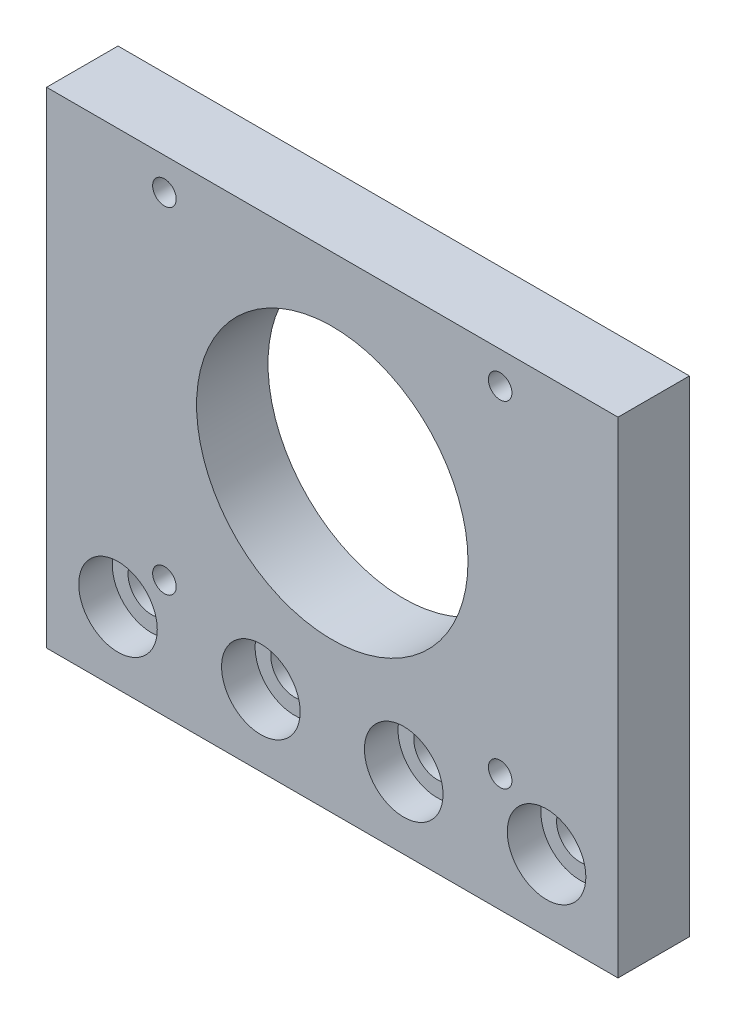
ISO-10303-21;
HEADER;
FILE_DESCRIPTION(('STEP AP214'),'2;1');
FILE_NAME('part.step','',(''),(''),'','','');
FILE_SCHEMA(('AUTOMOTIVE_DESIGN { 1 0 10303 214 1 1 1 1 }'));
ENDSEC;
DATA;
#1=APPLICATION_CONTEXT('core data for automotive mechanical design processes');
#2=APPLICATION_PROTOCOL_DEFINITION('international standard','automotive_design',2000,#1);
#3=PRODUCT_CONTEXT('',#1,'mechanical');
#4=PRODUCT('Part','Part','',(#3));
#5=PRODUCT_RELATED_PRODUCT_CATEGORY('part','',(#4));
#6=PRODUCT_DEFINITION_FORMATION('','',#4);
#7=PRODUCT_DEFINITION_CONTEXT('part definition',#1,'design');
#8=PRODUCT_DEFINITION('design','',#6,#7);
#9=PRODUCT_DEFINITION_SHAPE('','',#8);
#10=(LENGTH_UNIT() NAMED_UNIT(*) SI_UNIT(.MILLI.,.METRE.));
#11=(NAMED_UNIT(*) PLANE_ANGLE_UNIT() SI_UNIT($,.RADIAN.));
#12=(NAMED_UNIT(*) SI_UNIT($,.STERADIAN.) SOLID_ANGLE_UNIT());
#13=UNCERTAINTY_MEASURE_WITH_UNIT(LENGTH_MEASURE(1.E-05),#10,'distance_accuracy_value','');
#14=(GEOMETRIC_REPRESENTATION_CONTEXT(3) GLOBAL_UNCERTAINTY_ASSIGNED_CONTEXT((#13)) GLOBAL_UNIT_ASSIGNED_CONTEXT((#10,
#11,#12)) REPRESENTATION_CONTEXT('',''));
#15=CARTESIAN_POINT('',(0.,0.,0.));
#16=DIRECTION('',(0.,0.,1.));
#17=DIRECTION('',(1.,0.,0.));
#18=AXIS2_PLACEMENT_3D('',#15,#16,#17);
#19=CARTESIAN_POINT('',(0.,0.,-10.));
#20=DIRECTION('',(0.,0.,-1.));
#21=DIRECTION('',(-1.,0.,0.));
#22=AXIS2_PLACEMENT_3D('',#19,#20,#21);
#23=PLANE('',#22);
#24=CARTESIAN_POINT('',(-30.,0.,-10.));
#25=DIRECTION('',(0.,0.,-1.));
#26=DIRECTION('',(-1.,0.,0.));
#27=AXIS2_PLACEMENT_3D('',#24,#25,#26);
#28=CIRCLE('',#27,5.);
#29=CARTESIAN_POINT('',(-35.,0.,-10.));
#30=VERTEX_POINT('',#29);
#31=EDGE_CURVE('E229',#30,#30,#28,.T.);
#32=ORIENTED_EDGE('',*,*,#31,.F.);
#33=EDGE_LOOP('',(#32));
#34=FACE_BOUND('',#33,.T.);
#35=CARTESIAN_POINT('',(30.,0.,-10.));
#36=DIRECTION('',(0.,0.,1.));
#37=DIRECTION('',(1.,0.,0.));
#38=AXIS2_PLACEMENT_3D('',#35,#36,#37);
#39=CIRCLE('',#38,5.);
#40=CARTESIAN_POINT('',(35.,0.,-10.));
#41=VERTEX_POINT('',#40);
#42=EDGE_CURVE('E228',#41,#41,#39,.T.);
#43=ORIENTED_EDGE('',*,*,#42,.T.);
#44=EDGE_LOOP('',(#43));
#45=FACE_BOUND('',#44,.T.);
#46=CARTESIAN_POINT('',(23.5,23.5,-10.));
#47=DIRECTION('',(0.,0.,1.));
#48=DIRECTION('',(1.,0.,0.));
#49=AXIS2_PLACEMENT_3D('',#46,#47,#48);
#50=CIRCLE('',#49,1.65);
#51=CARTESIAN_POINT('',(25.15,23.5,-10.));
#52=VERTEX_POINT('',#51);
#53=EDGE_CURVE('E242',#52,#52,#50,.T.);
#54=ORIENTED_EDGE('',*,*,#53,.T.);
#55=EDGE_LOOP('',(#54));
#56=FACE_BOUND('',#55,.T.);
#57=CARTESIAN_POINT('',(-23.5,-23.5,-10.));
#58=DIRECTION('',(0.,0.,1.));
#59=DIRECTION('',(1.,0.,0.));
#60=AXIS2_PLACEMENT_3D('',#57,#58,#59);
#61=CIRCLE('',#60,1.65);
#62=CARTESIAN_POINT('',(-21.85,-23.5,-10.));
#63=VERTEX_POINT('',#62);
#64=EDGE_CURVE('E248',#63,#63,#61,.T.);
#65=ORIENTED_EDGE('',*,*,#64,.T.);
#66=EDGE_LOOP('',(#65));
#67=FACE_BOUND('',#66,.T.);
#68=CARTESIAN_POINT('',(-23.5,23.5,-10.));
#69=DIRECTION('',(0.,0.,1.));
#70=DIRECTION('',(1.,0.,0.));
#71=AXIS2_PLACEMENT_3D('',#68,#69,#70);
#72=CIRCLE('',#71,1.65);
#73=CARTESIAN_POINT('',(-21.85,23.5,-10.));
#74=VERTEX_POINT('',#73);
#75=EDGE_CURVE('E254',#74,#74,#72,.T.);
#76=ORIENTED_EDGE('',*,*,#75,.T.);
#77=EDGE_LOOP('',(#76));
#78=FACE_BOUND('',#77,.T.);
#79=CARTESIAN_POINT('',(23.5,-23.5,-10.));
#80=DIRECTION('',(0.,0.,1.));
#81=DIRECTION('',(1.,0.,0.));
#82=AXIS2_PLACEMENT_3D('',#79,#80,#81);
#83=CIRCLE('',#82,1.65);
#84=CARTESIAN_POINT('',(25.15,-23.5,-10.));
#85=VERTEX_POINT('',#84);
#86=EDGE_CURVE('E260',#85,#85,#83,.T.);
#87=ORIENTED_EDGE('',*,*,#86,.T.);
#88=EDGE_LOOP('',(#87));
#89=FACE_BOUND('',#88,.T.);
#90=DIRECTION('',(0.,-1.,0.));
#91=VECTOR('',#90,1.);
#92=CARTESIAN_POINT('',(-40.,-40.,-10.));
#93=LINE('',#92,#91);
#94=CARTESIAN_POINT('',(-40.,28.,-10.));
#95=VERTEX_POINT('',#94);
#96=CARTESIAN_POINT('',(-40.,-40.,-10.));
#97=VERTEX_POINT('',#96);
#98=EDGE_CURVE('E102',#95,#97,#93,.T.);
#99=ORIENTED_EDGE('',*,*,#98,.F.);
#100=DIRECTION('',(-1.,0.,0.));
#101=VECTOR('',#100,1.);
#102=CARTESIAN_POINT('',(-40.,28.,-10.));
#103=LINE('',#102,#101);
#104=CARTESIAN_POINT('',(40.,28.,-10.));
#105=VERTEX_POINT('',#104);
#106=EDGE_CURVE('E99',#105,#95,#103,.T.);
#107=ORIENTED_EDGE('',*,*,#106,.F.);
#108=DIRECTION('',(0.,1.,0.));
#109=VECTOR('',#108,1.);
#110=CARTESIAN_POINT('',(40.,-40.,-10.));
#111=LINE('',#110,#109);
#112=CARTESIAN_POINT('',(40.,-40.,-10.));
#113=VERTEX_POINT('',#112);
#114=EDGE_CURVE('E92',#113,#105,#111,.T.);
#115=ORIENTED_EDGE('',*,*,#114,.F.);
#116=DIRECTION('',(1.,0.,0.));
#117=VECTOR('',#116,1.);
#118=CARTESIAN_POINT('',(-40.,-40.,-10.));
#119=LINE('',#118,#117);
#120=EDGE_CURVE('E98',#97,#113,#119,.T.);
#121=ORIENTED_EDGE('',*,*,#120,.F.);
#122=EDGE_LOOP('',(#99,#107,#115,#121));
#123=FACE_BOUND('',#122,.T.);
#124=CARTESIAN_POINT('',(0.,0.,-10.));
#125=DIRECTION('',(0.,0.,1.));
#126=DIRECTION('',(1.,0.,0.));
#127=AXIS2_PLACEMENT_3D('',#124,#125,#126);
#128=CIRCLE('',#127,19.);
#129=CARTESIAN_POINT('',(19.,0.,-10.));
#130=VERTEX_POINT('',#129);
#131=EDGE_CURVE('E113',#130,#130,#128,.T.);
#132=ORIENTED_EDGE('',*,*,#131,.T.);
#133=EDGE_LOOP('',(#132));
#134=FACE_BOUND('',#133,.T.);
#135=CARTESIAN_POINT('',(-30.,-30.,-10.));
#136=DIRECTION('',(0.,0.,1.));
#137=DIRECTION('',(1.,0.,0.));
#138=AXIS2_PLACEMENT_3D('',#135,#136,#137);
#139=CIRCLE('',#138,3.3);
#140=CARTESIAN_POINT('',(-26.7,-30.,-10.));
#141=VERTEX_POINT('',#140);
#142=EDGE_CURVE('E308',#141,#141,#139,.T.);
#143=ORIENTED_EDGE('',*,*,#142,.T.);
#144=EDGE_LOOP('',(#143));
#145=FACE_BOUND('',#144,.T.);
#146=CARTESIAN_POINT('',(-9.99999999999999,-30.,-10.));
#147=DIRECTION('',(0.,0.,1.));
#148=DIRECTION('',(1.,0.,0.));
#149=AXIS2_PLACEMENT_3D('',#146,#147,#148);
#150=CIRCLE('',#149,3.3);
#151=CARTESIAN_POINT('',(-6.7,-30.,-10.));
#152=VERTEX_POINT('',#151);
#153=EDGE_CURVE('E296',#152,#152,#150,.T.);
#154=ORIENTED_EDGE('',*,*,#153,.T.);
#155=EDGE_LOOP('',(#154));
#156=FACE_BOUND('',#155,.T.);
#157=CARTESIAN_POINT('',(10.,-30.,-10.));
#158=DIRECTION('',(0.,0.,1.));
#159=DIRECTION('',(1.,0.,0.));
#160=AXIS2_PLACEMENT_3D('',#157,#158,#159);
#161=CIRCLE('',#160,3.3);
#162=CARTESIAN_POINT('',(13.3,-30.,-10.));
#163=VERTEX_POINT('',#162);
#164=EDGE_CURVE('E284',#163,#163,#161,.T.);
#165=ORIENTED_EDGE('',*,*,#164,.T.);
#166=EDGE_LOOP('',(#165));
#167=FACE_BOUND('',#166,.T.);
#168=CARTESIAN_POINT('',(30.,-30.,-10.));
#169=DIRECTION('',(0.,0.,1.));
#170=DIRECTION('',(1.,0.,0.));
#171=AXIS2_PLACEMENT_3D('',#168,#169,#170);
#172=CIRCLE('',#171,3.3);
#173=CARTESIAN_POINT('',(33.3,-30.,-10.));
#174=VERTEX_POINT('',#173);
#175=EDGE_CURVE('E272',#174,#174,#172,.T.);
#176=ORIENTED_EDGE('',*,*,#175,.T.);
#177=EDGE_LOOP('',(#176));
#178=FACE_BOUND('',#177,.T.);
#179=ADVANCED_FACE('F43',(#34,#45,#56,#67,#78,#89,#123,#134,#145,#156,#167,#178),#23,.T.);
#180=CARTESIAN_POINT('',(0.,0.,0.));
#181=DIRECTION('',(0.,0.,-1.));
#182=DIRECTION('',(-1.,0.,0.));
#183=AXIS2_PLACEMENT_3D('',#180,#181,#182);
#184=PLANE('',#183);
#185=CARTESIAN_POINT('',(23.5,23.5,0.));
#186=DIRECTION('',(0.,0.,1.));
#187=DIRECTION('',(1.,0.,0.));
#188=AXIS2_PLACEMENT_3D('',#185,#186,#187);
#189=CIRCLE('',#188,1.65);
#190=CARTESIAN_POINT('',(25.15,23.5,0.));
#191=VERTEX_POINT('',#190);
#192=EDGE_CURVE('E238',#191,#191,#189,.T.);
#193=ORIENTED_EDGE('',*,*,#192,.F.);
#194=EDGE_LOOP('',(#193));
#195=FACE_BOUND('',#194,.T.);
#196=CARTESIAN_POINT('',(-23.5,-23.5,0.));
#197=DIRECTION('',(0.,0.,1.));
#198=DIRECTION('',(1.,0.,0.));
#199=AXIS2_PLACEMENT_3D('',#196,#197,#198);
#200=CIRCLE('',#199,1.65);
#201=CARTESIAN_POINT('',(-21.85,-23.5,0.));
#202=VERTEX_POINT('',#201);
#203=EDGE_CURVE('E245',#202,#202,#200,.T.);
#204=ORIENTED_EDGE('',*,*,#203,.F.);
#205=EDGE_LOOP('',(#204));
#206=FACE_BOUND('',#205,.T.);
#207=CARTESIAN_POINT('',(-23.5,23.5,0.));
#208=DIRECTION('',(0.,0.,1.));
#209=DIRECTION('',(1.,0.,0.));
#210=AXIS2_PLACEMENT_3D('',#207,#208,#209);
#211=CIRCLE('',#210,1.65);
#212=CARTESIAN_POINT('',(-21.85,23.5,0.));
#213=VERTEX_POINT('',#212);
#214=EDGE_CURVE('E251',#213,#213,#211,.T.);
#215=ORIENTED_EDGE('',*,*,#214,.F.);
#216=EDGE_LOOP('',(#215));
#217=FACE_BOUND('',#216,.T.);
#218=CARTESIAN_POINT('',(23.5,-23.5,0.));
#219=DIRECTION('',(0.,0.,1.));
#220=DIRECTION('',(1.,0.,0.));
#221=AXIS2_PLACEMENT_3D('',#218,#219,#220);
#222=CIRCLE('',#221,1.65);
#223=CARTESIAN_POINT('',(25.15,-23.5,0.));
#224=VERTEX_POINT('',#223);
#225=EDGE_CURVE('E257',#224,#224,#222,.T.);
#226=ORIENTED_EDGE('',*,*,#225,.F.);
#227=EDGE_LOOP('',(#226));
#228=FACE_BOUND('',#227,.T.);
#229=CARTESIAN_POINT('',(30.,-30.,0.));
#230=DIRECTION('',(0.,0.,1.));
#231=DIRECTION('',(1.,0.,0.));
#232=AXIS2_PLACEMENT_3D('',#229,#230,#231);
#233=CIRCLE('',#232,5.5);
#234=CARTESIAN_POINT('',(35.5,-30.,0.));
#235=VERTEX_POINT('',#234);
#236=EDGE_CURVE('E263',#235,#235,#233,.T.);
#237=ORIENTED_EDGE('',*,*,#236,.F.);
#238=EDGE_LOOP('',(#237));
#239=FACE_BOUND('',#238,.T.);
#240=CARTESIAN_POINT('',(-9.99999999999999,-30.,0.));
#241=DIRECTION('',(0.,0.,1.));
#242=DIRECTION('',(1.,0.,0.));
#243=AXIS2_PLACEMENT_3D('',#240,#241,#242);
#244=CIRCLE('',#243,5.5);
#245=CARTESIAN_POINT('',(-4.5,-30.,0.));
#246=VERTEX_POINT('',#245);
#247=EDGE_CURVE('E287',#246,#246,#244,.T.);
#248=ORIENTED_EDGE('',*,*,#247,.F.);
#249=EDGE_LOOP('',(#248));
#250=FACE_BOUND('',#249,.T.);
#251=CARTESIAN_POINT('',(-30.,-30.,0.));
#252=DIRECTION('',(0.,0.,1.));
#253=DIRECTION('',(1.,0.,0.));
#254=AXIS2_PLACEMENT_3D('',#251,#252,#253);
#255=CIRCLE('',#254,5.5);
#256=CARTESIAN_POINT('',(-24.5,-30.,0.));
#257=VERTEX_POINT('',#256);
#258=EDGE_CURVE('E299',#257,#257,#255,.T.);
#259=ORIENTED_EDGE('',*,*,#258,.F.);
#260=EDGE_LOOP('',(#259));
#261=FACE_BOUND('',#260,.T.);
#262=CARTESIAN_POINT('',(0.,0.,0.));
#263=DIRECTION('',(0.,0.,1.));
#264=DIRECTION('',(1.,0.,0.));
#265=AXIS2_PLACEMENT_3D('',#262,#263,#264);
#266=CIRCLE('',#265,19.);
#267=CARTESIAN_POINT('',(19.,0.,0.));
#268=VERTEX_POINT('',#267);
#269=EDGE_CURVE('E311',#268,#268,#266,.T.);
#270=ORIENTED_EDGE('',*,*,#269,.F.);
#271=EDGE_LOOP('',(#270));
#272=FACE_BOUND('',#271,.T.);
#273=DIRECTION('',(0.,-1.,0.));
#274=VECTOR('',#273,1.);
#275=CARTESIAN_POINT('',(-40.,-40.,0.));
#276=LINE('',#275,#274);
#277=CARTESIAN_POINT('',(-40.,28.,0.));
#278=VERTEX_POINT('',#277);
#279=CARTESIAN_POINT('',(-40.,-40.,0.));
#280=VERTEX_POINT('',#279);
#281=EDGE_CURVE('E109',#278,#280,#276,.T.);
#282=ORIENTED_EDGE('',*,*,#281,.T.);
#283=DIRECTION('',(1.,0.,0.));
#284=VECTOR('',#283,1.);
#285=CARTESIAN_POINT('',(-40.,-40.,0.));
#286=LINE('',#285,#284);
#287=CARTESIAN_POINT('',(40.,-40.,0.));
#288=VERTEX_POINT('',#287);
#289=EDGE_CURVE('E112',#280,#288,#286,.T.);
#290=ORIENTED_EDGE('',*,*,#289,.T.);
#291=DIRECTION('',(0.,1.,0.));
#292=VECTOR('',#291,1.);
#293=CARTESIAN_POINT('',(40.,-40.,0.));
#294=LINE('',#293,#292);
#295=CARTESIAN_POINT('',(40.,28.,0.));
#296=VERTEX_POINT('',#295);
#297=EDGE_CURVE('E94',#288,#296,#294,.T.);
#298=ORIENTED_EDGE('',*,*,#297,.T.);
#299=DIRECTION('',(-1.,0.,0.));
#300=VECTOR('',#299,1.);
#301=CARTESIAN_POINT('',(-40.,28.,0.));
#302=LINE('',#301,#300);
#303=EDGE_CURVE('E104',#296,#278,#302,.T.);
#304=ORIENTED_EDGE('',*,*,#303,.T.);
#305=EDGE_LOOP('',(#282,#290,#298,#304));
#306=FACE_BOUND('',#305,.T.);
#307=CARTESIAN_POINT('',(10.,-30.,0.));
#308=DIRECTION('',(0.,0.,1.));
#309=DIRECTION('',(1.,0.,0.));
#310=AXIS2_PLACEMENT_3D('',#307,#308,#309);
#311=CIRCLE('',#310,5.5);
#312=CARTESIAN_POINT('',(15.5,-30.,0.));
#313=VERTEX_POINT('',#312);
#314=EDGE_CURVE('E275',#313,#313,#311,.T.);
#315=ORIENTED_EDGE('',*,*,#314,.F.);
#316=EDGE_LOOP('',(#315));
#317=FACE_BOUND('',#316,.T.);
#318=ADVANCED_FACE('F119',(#195,#206,#217,#228,#239,#250,#261,#272,#306,#317),#184,.F.);
#319=CARTESIAN_POINT('',(-40.,-40.,-10.));
#320=DIRECTION('',(-1.,0.,0.));
#321=DIRECTION('',(0.,0.,1.));
#322=AXIS2_PLACEMENT_3D('',#319,#320,#321);
#323=PLANE('',#322);
#324=ORIENTED_EDGE('',*,*,#281,.F.);
#325=DIRECTION('',(0.,0.,1.));
#326=VECTOR('',#325,1.);
#327=CARTESIAN_POINT('',(-40.,28.,-10.));
#328=LINE('',#327,#326);
#329=EDGE_CURVE('E11',#95,#278,#328,.T.);
#330=ORIENTED_EDGE('',*,*,#329,.F.);
#331=ORIENTED_EDGE('',*,*,#98,.T.);
#332=DIRECTION('',(0.,0.,1.));
#333=VECTOR('',#332,1.);
#334=CARTESIAN_POINT('',(-40.,-40.,-10.));
#335=LINE('',#334,#333);
#336=EDGE_CURVE('E47',#97,#280,#335,.T.);
#337=ORIENTED_EDGE('',*,*,#336,.T.);
#338=EDGE_LOOP('',(#324,#330,#331,#337));
#339=FACE_BOUND('',#338,.T.);
#340=ADVANCED_FACE('F45',(#339),#323,.T.);
#341=CARTESIAN_POINT('',(-40.,28.,-10.));
#342=DIRECTION('',(0.,1.,0.));
#343=DIRECTION('',(0.,0.,1.));
#344=AXIS2_PLACEMENT_3D('',#341,#342,#343);
#345=PLANE('',#344);
#346=ORIENTED_EDGE('',*,*,#303,.F.);
#347=DIRECTION('',(0.,0.,1.));
#348=VECTOR('',#347,1.);
#349=CARTESIAN_POINT('',(40.,28.,-10.));
#350=LINE('',#349,#348);
#351=EDGE_CURVE('E53',#105,#296,#350,.T.);
#352=ORIENTED_EDGE('',*,*,#351,.F.);
#353=ORIENTED_EDGE('',*,*,#106,.T.);
#354=ORIENTED_EDGE('',*,*,#329,.T.);
#355=EDGE_LOOP('',(#346,#352,#353,#354));
#356=FACE_BOUND('',#355,.T.);
#357=ADVANCED_FACE('F121',(#356),#345,.T.);
#358=CARTESIAN_POINT('',(40.,-40.,-10.));
#359=DIRECTION('',(1.,0.,0.));
#360=DIRECTION('',(0.,0.,-1.));
#361=AXIS2_PLACEMENT_3D('',#358,#359,#360);
#362=PLANE('',#361);
#363=ORIENTED_EDGE('',*,*,#297,.F.);
#364=DIRECTION('',(0.,0.,1.));
#365=VECTOR('',#364,1.);
#366=CARTESIAN_POINT('',(40.,-40.,-10.));
#367=LINE('',#366,#365);
#368=EDGE_CURVE('E89',#113,#288,#367,.T.);
#369=ORIENTED_EDGE('',*,*,#368,.F.);
#370=ORIENTED_EDGE('',*,*,#114,.T.);
#371=ORIENTED_EDGE('',*,*,#351,.T.);
#372=EDGE_LOOP('',(#363,#369,#370,#371));
#373=FACE_BOUND('',#372,.T.);
#374=ADVANCED_FACE('F91',(#373),#362,.T.);
#375=CARTESIAN_POINT('',(-40.,-40.,-10.));
#376=DIRECTION('',(0.,-1.,0.));
#377=DIRECTION('',(0.,0.,-1.));
#378=AXIS2_PLACEMENT_3D('',#375,#376,#377);
#379=PLANE('',#378);
#380=ORIENTED_EDGE('',*,*,#289,.F.);
#381=ORIENTED_EDGE('',*,*,#336,.F.);
#382=ORIENTED_EDGE('',*,*,#120,.T.);
#383=ORIENTED_EDGE('',*,*,#368,.T.);
#384=EDGE_LOOP('',(#380,#381,#382,#383));
#385=FACE_BOUND('',#384,.T.);
#386=ADVANCED_FACE('F101',(#385),#379,.T.);
#387=CARTESIAN_POINT('',(0.,0.,-10.));
#388=DIRECTION('',(0.,0.,1.));
#389=DIRECTION('',(1.,0.,0.));
#390=AXIS2_PLACEMENT_3D('',#387,#388,#389);
#391=CYLINDRICAL_SURFACE('',#390,19.);
#392=ORIENTED_EDGE('',*,*,#131,.F.);
#393=EDGE_LOOP('',(#392));
#394=FACE_BOUND('',#393,.T.);
#395=ORIENTED_EDGE('',*,*,#269,.T.);
#396=EDGE_LOOP('',(#395));
#397=FACE_BOUND('',#396,.T.);
#398=ADVANCED_FACE('F142',(#394,#397),#391,.F.);
#399=CARTESIAN_POINT('',(-30.,-30.,0.));
#400=DIRECTION('',(0.,0.,1.));
#401=DIRECTION('',(1.,0.,0.));
#402=AXIS2_PLACEMENT_3D('',#399,#400,#401);
#403=CYLINDRICAL_SURFACE('',#402,3.3);
#404=ORIENTED_EDGE('',*,*,#142,.F.);
#405=EDGE_LOOP('',(#404));
#406=FACE_BOUND('',#405,.T.);
#407=CARTESIAN_POINT('',(-30.,-30.,-4.7));
#408=DIRECTION('',(0.,0.,1.));
#409=DIRECTION('',(1.,0.,0.));
#410=AXIS2_PLACEMENT_3D('',#407,#408,#409);
#411=CIRCLE('',#410,3.3);
#412=CARTESIAN_POINT('',(-26.7,-30.,-4.7));
#413=VERTEX_POINT('',#412);
#414=EDGE_CURVE('E305',#413,#413,#411,.T.);
#415=ORIENTED_EDGE('',*,*,#414,.T.);
#416=EDGE_LOOP('',(#415));
#417=FACE_BOUND('',#416,.T.);
#418=ADVANCED_FACE('F145',(#406,#417),#403,.F.);
#419=CARTESIAN_POINT('',(-26.7,-30.,-4.7));
#420=DIRECTION('',(0.,0.,-1.));
#421=DIRECTION('',(-1.,0.,0.));
#422=AXIS2_PLACEMENT_3D('',#419,#420,#421);
#423=PLANE('',#422);
#424=ORIENTED_EDGE('',*,*,#414,.F.);
#425=EDGE_LOOP('',(#424));
#426=FACE_BOUND('',#425,.T.);
#427=CARTESIAN_POINT('',(-30.,-30.,-4.7));
#428=DIRECTION('',(0.,0.,1.));
#429=DIRECTION('',(1.,0.,0.));
#430=AXIS2_PLACEMENT_3D('',#427,#428,#429);
#431=CIRCLE('',#430,5.5);
#432=CARTESIAN_POINT('',(-24.5,-30.,-4.7));
#433=VERTEX_POINT('',#432);
#434=EDGE_CURVE('E302',#433,#433,#431,.T.);
#435=ORIENTED_EDGE('',*,*,#434,.T.);
#436=EDGE_LOOP('',(#435));
#437=FACE_BOUND('',#436,.T.);
#438=ADVANCED_FACE('F149',(#426,#437),#423,.F.);
#439=CARTESIAN_POINT('',(-30.,-30.,0.));
#440=DIRECTION('',(0.,0.,1.));
#441=DIRECTION('',(1.,0.,0.));
#442=AXIS2_PLACEMENT_3D('',#439,#440,#441);
#443=CYLINDRICAL_SURFACE('',#442,5.5);
#444=ORIENTED_EDGE('',*,*,#434,.F.);
#445=EDGE_LOOP('',(#444));
#446=FACE_BOUND('',#445,.T.);
#447=ORIENTED_EDGE('',*,*,#258,.T.);
#448=EDGE_LOOP('',(#447));
#449=FACE_BOUND('',#448,.T.);
#450=ADVANCED_FACE('F153',(#446,#449),#443,.F.);
#451=CARTESIAN_POINT('',(-9.99999999999999,-30.,0.));
#452=DIRECTION('',(0.,0.,1.));
#453=DIRECTION('',(1.,0.,0.));
#454=AXIS2_PLACEMENT_3D('',#451,#452,#453);
#455=CYLINDRICAL_SURFACE('',#454,3.3);
#456=ORIENTED_EDGE('',*,*,#153,.F.);
#457=EDGE_LOOP('',(#456));
#458=FACE_BOUND('',#457,.T.);
#459=CARTESIAN_POINT('',(-9.99999999999999,-30.,-4.7));
#460=DIRECTION('',(0.,0.,1.));
#461=DIRECTION('',(1.,0.,0.));
#462=AXIS2_PLACEMENT_3D('',#459,#460,#461);
#463=CIRCLE('',#462,3.3);
#464=CARTESIAN_POINT('',(-6.69999999999999,-30.,-4.7));
#465=VERTEX_POINT('',#464);
#466=EDGE_CURVE('E293',#465,#465,#463,.T.);
#467=ORIENTED_EDGE('',*,*,#466,.T.);
#468=EDGE_LOOP('',(#467));
#469=FACE_BOUND('',#468,.T.);
#470=ADVANCED_FACE('F157',(#458,#469),#455,.F.);
#471=CARTESIAN_POINT('',(-6.69999999999999,-30.,-4.7));
#472=DIRECTION('',(0.,0.,-1.));
#473=DIRECTION('',(-1.,0.,0.));
#474=AXIS2_PLACEMENT_3D('',#471,#472,#473);
#475=PLANE('',#474);
#476=ORIENTED_EDGE('',*,*,#466,.F.);
#477=EDGE_LOOP('',(#476));
#478=FACE_BOUND('',#477,.T.);
#479=CARTESIAN_POINT('',(-9.99999999999999,-30.,-4.7));
#480=DIRECTION('',(0.,0.,1.));
#481=DIRECTION('',(1.,0.,0.));
#482=AXIS2_PLACEMENT_3D('',#479,#480,#481);
#483=CIRCLE('',#482,5.5);
#484=CARTESIAN_POINT('',(-4.5,-30.,-4.7));
#485=VERTEX_POINT('',#484);
#486=EDGE_CURVE('E290',#485,#485,#483,.T.);
#487=ORIENTED_EDGE('',*,*,#486,.T.);
#488=EDGE_LOOP('',(#487));
#489=FACE_BOUND('',#488,.T.);
#490=ADVANCED_FACE('F161',(#478,#489),#475,.F.);
#491=CARTESIAN_POINT('',(-9.99999999999999,-30.,0.));
#492=DIRECTION('',(0.,0.,1.));
#493=DIRECTION('',(1.,0.,0.));
#494=AXIS2_PLACEMENT_3D('',#491,#492,#493);
#495=CYLINDRICAL_SURFACE('',#494,5.5);
#496=ORIENTED_EDGE('',*,*,#486,.F.);
#497=EDGE_LOOP('',(#496));
#498=FACE_BOUND('',#497,.T.);
#499=ORIENTED_EDGE('',*,*,#247,.T.);
#500=EDGE_LOOP('',(#499));
#501=FACE_BOUND('',#500,.T.);
#502=ADVANCED_FACE('F165',(#498,#501),#495,.F.);
#503=CARTESIAN_POINT('',(10.,-30.,0.));
#504=DIRECTION('',(0.,0.,1.));
#505=DIRECTION('',(1.,0.,0.));
#506=AXIS2_PLACEMENT_3D('',#503,#504,#505);
#507=CYLINDRICAL_SURFACE('',#506,3.3);
#508=ORIENTED_EDGE('',*,*,#164,.F.);
#509=EDGE_LOOP('',(#508));
#510=FACE_BOUND('',#509,.T.);
#511=CARTESIAN_POINT('',(10.,-30.,-4.7));
#512=DIRECTION('',(0.,0.,1.));
#513=DIRECTION('',(1.,0.,0.));
#514=AXIS2_PLACEMENT_3D('',#511,#512,#513);
#515=CIRCLE('',#514,3.3);
#516=CARTESIAN_POINT('',(13.3,-30.,-4.7));
#517=VERTEX_POINT('',#516);
#518=EDGE_CURVE('E281',#517,#517,#515,.T.);
#519=ORIENTED_EDGE('',*,*,#518,.T.);
#520=EDGE_LOOP('',(#519));
#521=FACE_BOUND('',#520,.T.);
#522=ADVANCED_FACE('F169',(#510,#521),#507,.F.);
#523=CARTESIAN_POINT('',(13.3,-30.,-4.7));
#524=DIRECTION('',(0.,0.,-1.));
#525=DIRECTION('',(-1.,0.,0.));
#526=AXIS2_PLACEMENT_3D('',#523,#524,#525);
#527=PLANE('',#526);
#528=ORIENTED_EDGE('',*,*,#518,.F.);
#529=EDGE_LOOP('',(#528));
#530=FACE_BOUND('',#529,.T.);
#531=CARTESIAN_POINT('',(10.,-30.,-4.7));
#532=DIRECTION('',(0.,0.,1.));
#533=DIRECTION('',(1.,0.,0.));
#534=AXIS2_PLACEMENT_3D('',#531,#532,#533);
#535=CIRCLE('',#534,5.5);
#536=CARTESIAN_POINT('',(15.5,-30.,-4.7));
#537=VERTEX_POINT('',#536);
#538=EDGE_CURVE('E278',#537,#537,#535,.T.);
#539=ORIENTED_EDGE('',*,*,#538,.T.);
#540=EDGE_LOOP('',(#539));
#541=FACE_BOUND('',#540,.T.);
#542=ADVANCED_FACE('F173',(#530,#541),#527,.F.);
#543=CARTESIAN_POINT('',(10.,-30.,0.));
#544=DIRECTION('',(0.,0.,1.));
#545=DIRECTION('',(1.,0.,0.));
#546=AXIS2_PLACEMENT_3D('',#543,#544,#545);
#547=CYLINDRICAL_SURFACE('',#546,5.5);
#548=ORIENTED_EDGE('',*,*,#538,.F.);
#549=EDGE_LOOP('',(#548));
#550=FACE_BOUND('',#549,.T.);
#551=ORIENTED_EDGE('',*,*,#314,.T.);
#552=EDGE_LOOP('',(#551));
#553=FACE_BOUND('',#552,.T.);
#554=ADVANCED_FACE('F177',(#550,#553),#547,.F.);
#555=CARTESIAN_POINT('',(30.,-30.,0.));
#556=DIRECTION('',(0.,0.,1.));
#557=DIRECTION('',(1.,0.,0.));
#558=AXIS2_PLACEMENT_3D('',#555,#556,#557);
#559=CYLINDRICAL_SURFACE('',#558,3.3);
#560=ORIENTED_EDGE('',*,*,#175,.F.);
#561=EDGE_LOOP('',(#560));
#562=FACE_BOUND('',#561,.T.);
#563=CARTESIAN_POINT('',(30.,-30.,-4.7));
#564=DIRECTION('',(0.,0.,1.));
#565=DIRECTION('',(1.,0.,0.));
#566=AXIS2_PLACEMENT_3D('',#563,#564,#565);
#567=CIRCLE('',#566,3.3);
#568=CARTESIAN_POINT('',(33.3,-30.,-4.7));
#569=VERTEX_POINT('',#568);
#570=EDGE_CURVE('E269',#569,#569,#567,.T.);
#571=ORIENTED_EDGE('',*,*,#570,.T.);
#572=EDGE_LOOP('',(#571));
#573=FACE_BOUND('',#572,.T.);
#574=ADVANCED_FACE('F181',(#562,#573),#559,.F.);
#575=CARTESIAN_POINT('',(33.3,-30.,-4.7));
#576=DIRECTION('',(0.,0.,-1.));
#577=DIRECTION('',(-1.,0.,0.));
#578=AXIS2_PLACEMENT_3D('',#575,#576,#577);
#579=PLANE('',#578);
#580=ORIENTED_EDGE('',*,*,#570,.F.);
#581=EDGE_LOOP('',(#580));
#582=FACE_BOUND('',#581,.T.);
#583=CARTESIAN_POINT('',(30.,-30.,-4.7));
#584=DIRECTION('',(0.,0.,1.));
#585=DIRECTION('',(1.,0.,0.));
#586=AXIS2_PLACEMENT_3D('',#583,#584,#585);
#587=CIRCLE('',#586,5.5);
#588=CARTESIAN_POINT('',(35.5,-30.,-4.7));
#589=VERTEX_POINT('',#588);
#590=EDGE_CURVE('E266',#589,#589,#587,.T.);
#591=ORIENTED_EDGE('',*,*,#590,.T.);
#592=EDGE_LOOP('',(#591));
#593=FACE_BOUND('',#592,.T.);
#594=ADVANCED_FACE('F185',(#582,#593),#579,.F.);
#595=CARTESIAN_POINT('',(30.,-30.,0.));
#596=DIRECTION('',(0.,0.,1.));
#597=DIRECTION('',(1.,0.,0.));
#598=AXIS2_PLACEMENT_3D('',#595,#596,#597);
#599=CYLINDRICAL_SURFACE('',#598,5.5);
#600=ORIENTED_EDGE('',*,*,#590,.F.);
#601=EDGE_LOOP('',(#600));
#602=FACE_BOUND('',#601,.T.);
#603=ORIENTED_EDGE('',*,*,#236,.T.);
#604=EDGE_LOOP('',(#603));
#605=FACE_BOUND('',#604,.T.);
#606=ADVANCED_FACE('F189',(#602,#605),#599,.F.);
#607=CARTESIAN_POINT('',(23.5,-23.5,0.));
#608=DIRECTION('',(0.,0.,1.));
#609=DIRECTION('',(1.,0.,0.));
#610=AXIS2_PLACEMENT_3D('',#607,#608,#609);
#611=CYLINDRICAL_SURFACE('',#610,1.65);
#612=ORIENTED_EDGE('',*,*,#86,.F.);
#613=EDGE_LOOP('',(#612));
#614=FACE_BOUND('',#613,.T.);
#615=ORIENTED_EDGE('',*,*,#225,.T.);
#616=EDGE_LOOP('',(#615));
#617=FACE_BOUND('',#616,.T.);
#618=ADVANCED_FACE('F193',(#614,#617),#611,.F.);
#619=CARTESIAN_POINT('',(-23.5,23.5,0.));
#620=DIRECTION('',(0.,0.,1.));
#621=DIRECTION('',(1.,0.,0.));
#622=AXIS2_PLACEMENT_3D('',#619,#620,#621);
#623=CYLINDRICAL_SURFACE('',#622,1.65);
#624=ORIENTED_EDGE('',*,*,#75,.F.);
#625=EDGE_LOOP('',(#624));
#626=FACE_BOUND('',#625,.T.);
#627=ORIENTED_EDGE('',*,*,#214,.T.);
#628=EDGE_LOOP('',(#627));
#629=FACE_BOUND('',#628,.T.);
#630=ADVANCED_FACE('F197',(#626,#629),#623,.F.);
#631=CARTESIAN_POINT('',(-23.5,-23.5,0.));
#632=DIRECTION('',(0.,0.,1.));
#633=DIRECTION('',(1.,0.,0.));
#634=AXIS2_PLACEMENT_3D('',#631,#632,#633);
#635=CYLINDRICAL_SURFACE('',#634,1.65);
#636=ORIENTED_EDGE('',*,*,#64,.F.);
#637=EDGE_LOOP('',(#636));
#638=FACE_BOUND('',#637,.T.);
#639=ORIENTED_EDGE('',*,*,#203,.T.);
#640=EDGE_LOOP('',(#639));
#641=FACE_BOUND('',#640,.T.);
#642=ADVANCED_FACE('F201',(#638,#641),#635,.F.);
#643=CARTESIAN_POINT('',(23.5,23.5,0.));
#644=DIRECTION('',(0.,0.,1.));
#645=DIRECTION('',(1.,0.,0.));
#646=AXIS2_PLACEMENT_3D('',#643,#644,#645);
#647=CYLINDRICAL_SURFACE('',#646,1.65);
#648=ORIENTED_EDGE('',*,*,#53,.F.);
#649=EDGE_LOOP('',(#648));
#650=FACE_BOUND('',#649,.T.);
#651=ORIENTED_EDGE('',*,*,#192,.T.);
#652=EDGE_LOOP('',(#651));
#653=FACE_BOUND('',#652,.T.);
#654=ADVANCED_FACE('F205',(#650,#653),#647,.F.);
#655=CARTESIAN_POINT('',(30.,0.,-5.));
#656=DIRECTION('',(0.,0.,-1.));
#657=DIRECTION('',(-1.,0.,0.));
#658=AXIS2_PLACEMENT_3D('',#655,#656,#657);
#659=CYLINDRICAL_SURFACE('',#658,5.);
#660=CARTESIAN_POINT('',(30.,0.,-5.));
#661=DIRECTION('',(0.,0.,1.));
#662=DIRECTION('',(1.,0.,0.));
#663=AXIS2_PLACEMENT_3D('',#660,#661,#662);
#664=CIRCLE('',#663,5.);
#665=CARTESIAN_POINT('',(35.,0.,-5.));
#666=VERTEX_POINT('',#665);
#667=EDGE_CURVE('E232',#666,#666,#664,.T.);
#668=ORIENTED_EDGE('',*,*,#667,.T.);
#669=EDGE_LOOP('',(#668));
#670=FACE_BOUND('',#669,.T.);
#671=ORIENTED_EDGE('',*,*,#42,.F.);
#672=EDGE_LOOP('',(#671));
#673=FACE_BOUND('',#672,.T.);
#674=ADVANCED_FACE('F209',(#670,#673),#659,.F.);
#675=CARTESIAN_POINT('',(30.,0.,-5.));
#676=DIRECTION('',(0.,0.,1.));
#677=DIRECTION('',(1.,0.,0.));
#678=AXIS2_PLACEMENT_3D('',#675,#676,#677);
#679=PLANE('',#678);
#680=ORIENTED_EDGE('',*,*,#667,.F.);
#681=EDGE_LOOP('',(#680));
#682=FACE_BOUND('',#681,.T.);
#683=ADVANCED_FACE('F213',(#682),#679,.F.);
#684=CARTESIAN_POINT('',(-30.,0.,-5.));
#685=DIRECTION('',(0.,0.,-1.));
#686=DIRECTION('',(-1.,0.,0.));
#687=AXIS2_PLACEMENT_3D('',#684,#685,#686);
#688=CYLINDRICAL_SURFACE('',#687,5.);
#689=CARTESIAN_POINT('',(-30.,0.,-5.));
#690=DIRECTION('',(0.,0.,-1.));
#691=DIRECTION('',(-1.,0.,0.));
#692=AXIS2_PLACEMENT_3D('',#689,#690,#691);
#693=CIRCLE('',#692,5.);
#694=CARTESIAN_POINT('',(-35.,0.,-5.));
#695=VERTEX_POINT('',#694);
#696=EDGE_CURVE('E227',#695,#695,#693,.T.);
#697=ORIENTED_EDGE('',*,*,#696,.F.);
#698=EDGE_LOOP('',(#697));
#699=FACE_BOUND('',#698,.T.);
#700=ORIENTED_EDGE('',*,*,#31,.T.);
#701=EDGE_LOOP('',(#700));
#702=FACE_BOUND('',#701,.T.);
#703=ADVANCED_FACE('F216',(#699,#702),#688,.F.);
#704=CARTESIAN_POINT('',(-30.,0.,-5.));
#705=DIRECTION('',(0.,0.,1.));
#706=DIRECTION('',(-1.,0.,0.));
#707=AXIS2_PLACEMENT_3D('',#704,#705,#706);
#708=PLANE('',#707);
#709=ORIENTED_EDGE('',*,*,#696,.T.);
#710=EDGE_LOOP('',(#709));
#711=FACE_BOUND('',#710,.T.);
#712=ADVANCED_FACE('F219',(#711),#708,.F.);
#713=CLOSED_SHELL('',(#179,#318,#340,#357,#374,#386,#398,#418,#438,#450,#470,#490,#502,#522,
#542,#554,#574,#594,#606,#618,#630,#642,#654,#674,#683,#703,#712));
#714=MANIFOLD_SOLID_BREP('B2',#713);
#715=ADVANCED_BREP_SHAPE_REPRESENTATION('',(#18,#714),#14);
#716=SHAPE_DEFINITION_REPRESENTATION(#9,#715);
ENDSEC;
END-ISO-10303-21;
